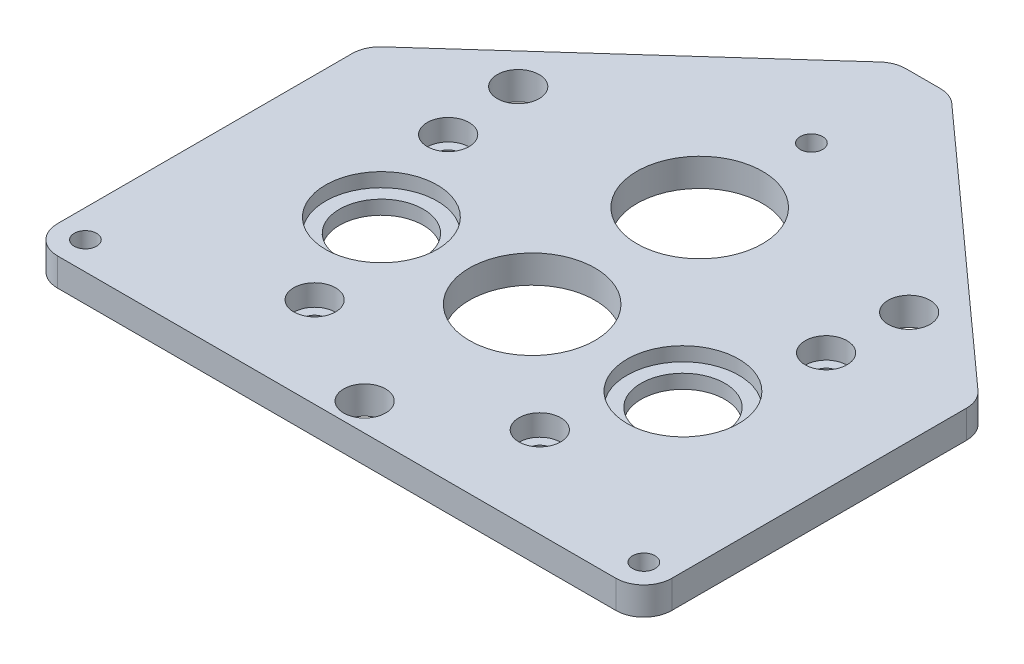
ISO-10303-21;
HEADER;
FILE_DESCRIPTION(('STEP AP214'),'2;1');
FILE_NAME('part.step','',(''),(''),'','','');
FILE_SCHEMA(('AUTOMOTIVE_DESIGN { 1 0 10303 214 1 1 1 1 }'));
ENDSEC;
DATA;
#1=APPLICATION_CONTEXT('core data for automotive mechanical design processes');
#2=APPLICATION_PROTOCOL_DEFINITION('international standard','automotive_design',2000,#1);
#3=PRODUCT_CONTEXT('',#1,'mechanical');
#4=PRODUCT('Part','Part','',(#3));
#5=PRODUCT_RELATED_PRODUCT_CATEGORY('part','',(#4));
#6=PRODUCT_DEFINITION_FORMATION('','',#4);
#7=PRODUCT_DEFINITION_CONTEXT('part definition',#1,'design');
#8=PRODUCT_DEFINITION('design','',#6,#7);
#9=PRODUCT_DEFINITION_SHAPE('','',#8);
#10=(LENGTH_UNIT() NAMED_UNIT(*) SI_UNIT(.MILLI.,.METRE.));
#11=(NAMED_UNIT(*) PLANE_ANGLE_UNIT() SI_UNIT($,.RADIAN.));
#12=(NAMED_UNIT(*) SI_UNIT($,.STERADIAN.) SOLID_ANGLE_UNIT());
#13=UNCERTAINTY_MEASURE_WITH_UNIT(LENGTH_MEASURE(1.E-05),#10,'distance_accuracy_value','');
#14=(GEOMETRIC_REPRESENTATION_CONTEXT(3) GLOBAL_UNCERTAINTY_ASSIGNED_CONTEXT((#13)) GLOBAL_UNIT_ASSIGNED_CONTEXT((#10,
#11,#12)) REPRESENTATION_CONTEXT('',''));
#15=CARTESIAN_POINT('',(0.,0.,0.));
#16=DIRECTION('',(0.,0.,1.));
#17=DIRECTION('',(1.,0.,0.));
#18=AXIS2_PLACEMENT_3D('',#15,#16,#17);
#19=CARTESIAN_POINT('',(34.29,0.,-25.4));
#20=DIRECTION('',(0.,1.,0.));
#21=DIRECTION('',(0.,0.,1.));
#22=AXIS2_PLACEMENT_3D('',#19,#20,#21);
#23=CYLINDRICAL_SURFACE('',#22,9.525);
#24=CARTESIAN_POINT('',(34.29,0.,-25.4));
#25=DIRECTION('',(0.,1.,0.));
#26=DIRECTION('',(0.,0.,1.));
#27=AXIS2_PLACEMENT_3D('',#24,#25,#26);
#28=CIRCLE('',#27,9.525);
#29=CARTESIAN_POINT('',(34.29,0.,-15.875));
#30=VERTEX_POINT('',#29);
#31=EDGE_CURVE('E261',#30,#30,#28,.T.);
#32=ORIENTED_EDGE('',*,*,#31,.F.);
#33=EDGE_LOOP('',(#32));
#34=FACE_BOUND('',#33,.T.);
#35=CARTESIAN_POINT('',(34.29,3.175,-25.4));
#36=DIRECTION('',(0.,1.,0.));
#37=DIRECTION('',(0.,0.,1.));
#38=AXIS2_PLACEMENT_3D('',#35,#36,#37);
#39=CIRCLE('',#38,9.525);
#40=CARTESIAN_POINT('',(34.29,3.175,-15.875));
#41=VERTEX_POINT('',#40);
#42=EDGE_CURVE('E166',#41,#41,#39,.F.);
#43=ORIENTED_EDGE('',*,*,#42,.F.);
#44=EDGE_LOOP('',(#43));
#45=FACE_BOUND('',#44,.T.);
#46=ADVANCED_FACE('F33',(#34,#45),#23,.F.);
#47=CARTESIAN_POINT('',(-34.29,0.,-25.4));
#48=DIRECTION('',(0.,1.,0.));
#49=DIRECTION('',(0.,0.,1.));
#50=AXIS2_PLACEMENT_3D('',#47,#48,#49);
#51=CYLINDRICAL_SURFACE('',#50,9.525);
#52=CARTESIAN_POINT('',(-34.29,0.,-25.4));
#53=DIRECTION('',(0.,1.,0.));
#54=DIRECTION('',(0.,0.,1.));
#55=AXIS2_PLACEMENT_3D('',#52,#53,#54);
#56=CIRCLE('',#55,9.525);
#57=CARTESIAN_POINT('',(-34.29,0.,-15.875));
#58=VERTEX_POINT('',#57);
#59=EDGE_CURVE('E234',#58,#58,#56,.T.);
#60=ORIENTED_EDGE('',*,*,#59,.F.);
#61=EDGE_LOOP('',(#60));
#62=FACE_BOUND('',#61,.T.);
#63=CARTESIAN_POINT('',(-34.29,3.175,-25.4));
#64=DIRECTION('',(0.,1.,0.));
#65=DIRECTION('',(0.,0.,1.));
#66=AXIS2_PLACEMENT_3D('',#63,#64,#65);
#67=CIRCLE('',#66,9.525);
#68=CARTESIAN_POINT('',(-34.29,3.175,-15.875));
#69=VERTEX_POINT('',#68);
#70=EDGE_CURVE('E161',#69,#69,#67,.F.);
#71=ORIENTED_EDGE('',*,*,#70,.F.);
#72=EDGE_LOOP('',(#71));
#73=FACE_BOUND('',#72,.T.);
#74=ADVANCED_FACE('F396',(#62,#73),#51,.F.);
#75=CARTESIAN_POINT('',(69.85,6.35,-57.15));
#76=DIRECTION('',(-0.66896473162245,0.,0.743294146247166));
#77=DIRECTION('',(0.743294146247166,0.,0.66896473162245));
#78=AXIS2_PLACEMENT_3D('',#75,#76,#77);
#79=PLANE('',#78);
#80=DIRECTION('',(-0.743294146247166,0.,-0.66896473162245));
#81=VECTOR('',#80,1.);
#82=CARTESIAN_POINT('',(69.85,0.,-57.15));
#83=LINE('',#82,#81);
#84=CARTESIAN_POINT('',(67.7479260458025,0.,-59.0418665587777));
#85=VERTEX_POINT('',#84);
#86=CARTESIAN_POINT('',(8.16120241258942,0.,-112.669917828669));
#87=VERTEX_POINT('',#86);
#88=EDGE_CURVE('E232',#85,#87,#83,.T.);
#89=ORIENTED_EDGE('',*,*,#88,.T.);
#90=DIRECTION('',(0.,-1.,0.));
#91=VECTOR('',#90,1.);
#92=CARTESIAN_POINT('',(8.16120241258941,6.35,-112.669917828669));
#93=LINE('',#92,#91);
#94=CARTESIAN_POINT('',(8.16120241258942,6.35,-112.669917828669));
#95=VERTEX_POINT('',#94);
#96=EDGE_CURVE('E208',#87,#95,#93,.F.);
#97=ORIENTED_EDGE('',*,*,#96,.T.);
#98=DIRECTION('',(-0.743294146247166,0.,-0.66896473162245));
#99=VECTOR('',#98,1.);
#100=CARTESIAN_POINT('',(69.85,6.35,-57.15));
#101=LINE('',#100,#99);
#102=CARTESIAN_POINT('',(67.7479260458025,6.35,-59.0418665587777));
#103=VERTEX_POINT('',#102);
#104=EDGE_CURVE('E160',#103,#95,#101,.T.);
#105=ORIENTED_EDGE('',*,*,#104,.F.);
#106=DIRECTION('',(0.,-1.,0.));
#107=VECTOR('',#106,1.);
#108=CARTESIAN_POINT('',(67.7479260458025,6.35,-59.0418665587777));
#109=LINE('',#108,#107);
#110=EDGE_CURVE('E205',#103,#85,#109,.T.);
#111=ORIENTED_EDGE('',*,*,#110,.T.);
#112=EDGE_LOOP('',(#89,#97,#105,#111));
#113=FACE_BOUND('',#112,.T.);
#114=ADVANCED_FACE('F399',(#113),#79,.F.);
#115=CARTESIAN_POINT('',(6.34999999999999,6.35,-114.3));
#116=DIRECTION('',(0.,0.,1.));
#117=DIRECTION('',(1.,0.,0.));
#118=AXIS2_PLACEMENT_3D('',#115,#116,#117);
#119=PLANE('',#118);
#120=DIRECTION('',(-1.,0.,0.));
#121=VECTOR('',#120,1.);
#122=CARTESIAN_POINT('',(6.34999999999999,0.,-114.3));
#123=LINE('',#122,#121);
#124=CARTESIAN_POINT('',(3.91327636678685,0.,-114.3));
#125=VERTEX_POINT('',#124);
#126=CARTESIAN_POINT('',(-3.91327636678688,0.,-114.3));
#127=VERTEX_POINT('',#126);
#128=EDGE_CURVE('E155',#125,#127,#123,.T.);
#129=ORIENTED_EDGE('',*,*,#128,.T.);
#130=DIRECTION('',(0.,-1.,0.));
#131=VECTOR('',#130,1.);
#132=CARTESIAN_POINT('',(-3.91327636678688,6.35,-114.3));
#133=LINE('',#132,#131);
#134=CARTESIAN_POINT('',(-3.91327636678688,6.35,-114.3));
#135=VERTEX_POINT('',#134);
#136=EDGE_CURVE('E203',#127,#135,#133,.F.);
#137=ORIENTED_EDGE('',*,*,#136,.T.);
#138=DIRECTION('',(-1.,0.,0.));
#139=VECTOR('',#138,1.);
#140=CARTESIAN_POINT('',(6.34999999999999,6.35,-114.3));
#141=LINE('',#140,#139);
#142=CARTESIAN_POINT('',(3.91327636678685,6.35,-114.3));
#143=VERTEX_POINT('',#142);
#144=EDGE_CURVE('E251',#143,#135,#141,.T.);
#145=ORIENTED_EDGE('',*,*,#144,.F.);
#146=DIRECTION('',(0.,-1.,0.));
#147=VECTOR('',#146,1.);
#148=CARTESIAN_POINT('',(3.91327636678685,6.35,-114.3));
#149=LINE('',#148,#147);
#150=EDGE_CURVE('E200',#143,#125,#149,.T.);
#151=ORIENTED_EDGE('',*,*,#150,.T.);
#152=EDGE_LOOP('',(#129,#137,#145,#151));
#153=FACE_BOUND('',#152,.T.);
#154=ADVANCED_FACE('F239',(#153),#119,.F.);
#155=CARTESIAN_POINT('',(-6.35000000000001,6.35,-114.3));
#156=DIRECTION('',(0.66896473162245,0.,0.743294146247166));
#157=DIRECTION('',(0.743294146247166,0.,-0.66896473162245));
#158=AXIS2_PLACEMENT_3D('',#155,#156,#157);
#159=PLANE('',#158);
#160=DIRECTION('',(-0.743294146247166,0.,0.66896473162245));
#161=VECTOR('',#160,1.);
#162=CARTESIAN_POINT('',(-6.35000000000001,0.,-114.3));
#163=LINE('',#162,#161);
#164=CARTESIAN_POINT('',(-8.16120241258944,0.,-112.66991782867));
#165=VERTEX_POINT('',#164);
#166=CARTESIAN_POINT('',(-67.7479260458025,0.,-59.0418665587777));
#167=VERTEX_POINT('',#166);
#168=EDGE_CURVE('E150',#165,#167,#163,.T.);
#169=ORIENTED_EDGE('',*,*,#168,.T.);
#170=DIRECTION('',(0.,-1.,0.));
#171=VECTOR('',#170,1.);
#172=CARTESIAN_POINT('',(-67.7479260458026,6.35,-59.0418665587777));
#173=LINE('',#172,#171);
#174=CARTESIAN_POINT('',(-67.7479260458025,6.35,-59.0418665587777));
#175=VERTEX_POINT('',#174);
#176=EDGE_CURVE('E128',#167,#175,#173,.F.);
#177=ORIENTED_EDGE('',*,*,#176,.T.);
#178=DIRECTION('',(-0.743294146247166,0.,0.66896473162245));
#179=VECTOR('',#178,1.);
#180=CARTESIAN_POINT('',(-6.35000000000001,6.35,-114.3));
#181=LINE('',#180,#179);
#182=CARTESIAN_POINT('',(-8.16120241258944,6.35,-112.66991782867));
#183=VERTEX_POINT('',#182);
#184=EDGE_CURVE('E250',#183,#175,#181,.T.);
#185=ORIENTED_EDGE('',*,*,#184,.F.);
#186=DIRECTION('',(0.,-1.,0.));
#187=VECTOR('',#186,1.);
#188=CARTESIAN_POINT('',(-8.16120241258944,6.35,-112.66991782867));
#189=LINE('',#188,#187);
#190=EDGE_CURVE('E133',#183,#165,#189,.T.);
#191=ORIENTED_EDGE('',*,*,#190,.T.);
#192=EDGE_LOOP('',(#169,#177,#185,#191));
#193=FACE_BOUND('',#192,.T.);
#194=ADVANCED_FACE('F253',(#193),#159,.F.);
#195=CARTESIAN_POINT('',(-69.85,6.35,-57.15));
#196=DIRECTION('',(1.,0.,0.));
#197=DIRECTION('',(0.,0.,-1.));
#198=AXIS2_PLACEMENT_3D('',#195,#196,#197);
#199=PLANE('',#198);
#200=DIRECTION('',(0.,0.,1.));
#201=VECTOR('',#200,1.);
#202=CARTESIAN_POINT('',(-69.85,6.35,-57.15));
#203=LINE('',#202,#201);
#204=CARTESIAN_POINT('',(-69.85,6.35,-54.3219487301082));
#205=VERTEX_POINT('',#204);
#206=CARTESIAN_POINT('',(-69.85,6.35,12.7));
#207=VERTEX_POINT('',#206);
#208=EDGE_CURVE('E143',#205,#207,#203,.T.);
#209=ORIENTED_EDGE('',*,*,#208,.F.);
#210=DIRECTION('',(0.,-1.,0.));
#211=VECTOR('',#210,1.);
#212=CARTESIAN_POINT('',(-69.85,6.35,-54.3219487301082));
#213=LINE('',#212,#211);
#214=CARTESIAN_POINT('',(-69.85,0.,-54.3219487301082));
#215=VERTEX_POINT('',#214);
#216=EDGE_CURVE('E127',#205,#215,#213,.T.);
#217=ORIENTED_EDGE('',*,*,#216,.T.);
#218=DIRECTION('',(0.,0.,1.));
#219=VECTOR('',#218,1.);
#220=CARTESIAN_POINT('',(-69.85,0.,-57.15));
#221=LINE('',#220,#219);
#222=CARTESIAN_POINT('',(-69.85,0.,12.7));
#223=VERTEX_POINT('',#222);
#224=EDGE_CURVE('E140',#215,#223,#221,.T.);
#225=ORIENTED_EDGE('',*,*,#224,.T.);
#226=DIRECTION('',(0.,-1.,0.));
#227=VECTOR('',#226,1.);
#228=CARTESIAN_POINT('',(-69.85,6.35,12.7));
#229=LINE('',#228,#227);
#230=EDGE_CURVE('E145',#223,#207,#229,.F.);
#231=ORIENTED_EDGE('',*,*,#230,.T.);
#232=EDGE_LOOP('',(#209,#217,#225,#231));
#233=FACE_BOUND('',#232,.T.);
#234=ADVANCED_FACE('F139',(#233),#199,.F.);
#235=CARTESIAN_POINT('',(-69.85,6.35,19.05));
#236=DIRECTION('',(0.,0.,-1.));
#237=DIRECTION('',(-1.,0.,0.));
#238=AXIS2_PLACEMENT_3D('',#235,#236,#237);
#239=PLANE('',#238);
#240=DIRECTION('',(1.,0.,0.));
#241=VECTOR('',#240,1.);
#242=CARTESIAN_POINT('',(-69.85,0.,19.05));
#243=LINE('',#242,#241);
#244=CARTESIAN_POINT('',(-63.5,0.,19.05));
#245=VERTEX_POINT('',#244);
#246=CARTESIAN_POINT('',(63.5,0.,19.05));
#247=VERTEX_POINT('',#246);
#248=EDGE_CURVE('E149',#245,#247,#243,.T.);
#249=ORIENTED_EDGE('',*,*,#248,.T.);
#250=DIRECTION('',(0.,-1.,0.));
#251=VECTOR('',#250,1.);
#252=CARTESIAN_POINT('',(63.5,6.35,19.05));
#253=LINE('',#252,#251);
#254=CARTESIAN_POINT('',(63.5,6.35,19.05));
#255=VERTEX_POINT('',#254);
#256=EDGE_CURVE('E11',#247,#255,#253,.F.);
#257=ORIENTED_EDGE('',*,*,#256,.T.);
#258=DIRECTION('',(1.,0.,0.));
#259=VECTOR('',#258,1.);
#260=CARTESIAN_POINT('',(-69.85,6.35,19.05));
#261=LINE('',#260,#259);
#262=CARTESIAN_POINT('',(-63.5,6.35,19.05));
#263=VERTEX_POINT('',#262);
#264=EDGE_CURVE('E219',#263,#255,#261,.T.);
#265=ORIENTED_EDGE('',*,*,#264,.F.);
#266=DIRECTION('',(0.,-1.,0.));
#267=VECTOR('',#266,1.);
#268=CARTESIAN_POINT('',(-63.5,6.35,19.05));
#269=LINE('',#268,#267);
#270=EDGE_CURVE('E41',#263,#245,#269,.T.);
#271=ORIENTED_EDGE('',*,*,#270,.T.);
#272=EDGE_LOOP('',(#249,#257,#265,#271));
#273=FACE_BOUND('',#272,.T.);
#274=ADVANCED_FACE('F217',(#273),#239,.F.);
#275=CARTESIAN_POINT('',(69.85,6.35,19.05));
#276=DIRECTION('',(-1.,0.,0.));
#277=DIRECTION('',(0.,0.,1.));
#278=AXIS2_PLACEMENT_3D('',#275,#276,#277);
#279=PLANE('',#278);
#280=DIRECTION('',(0.,0.,-1.));
#281=VECTOR('',#280,1.);
#282=CARTESIAN_POINT('',(69.85,0.,19.05));
#283=LINE('',#282,#281);
#284=CARTESIAN_POINT('',(69.85,0.,12.7));
#285=VERTEX_POINT('',#284);
#286=CARTESIAN_POINT('',(69.85,0.,-54.3219487301082));
#287=VERTEX_POINT('',#286);
#288=EDGE_CURVE('E153',#285,#287,#283,.T.);
#289=ORIENTED_EDGE('',*,*,#288,.T.);
#290=DIRECTION('',(0.,-1.,0.));
#291=VECTOR('',#290,1.);
#292=CARTESIAN_POINT('',(69.85,6.35,-54.3219487301082));
#293=LINE('',#292,#291);
#294=CARTESIAN_POINT('',(69.85,6.35,-54.3219487301082));
#295=VERTEX_POINT('',#294);
#296=EDGE_CURVE('E48',#287,#295,#293,.F.);
#297=ORIENTED_EDGE('',*,*,#296,.T.);
#298=DIRECTION('',(0.,0.,-1.));
#299=VECTOR('',#298,1.);
#300=CARTESIAN_POINT('',(69.85,6.35,19.05));
#301=LINE('',#300,#299);
#302=CARTESIAN_POINT('',(69.85,6.35,12.7));
#303=VERTEX_POINT('',#302);
#304=EDGE_CURVE('E176',#303,#295,#301,.T.);
#305=ORIENTED_EDGE('',*,*,#304,.F.);
#306=DIRECTION('',(0.,-1.,0.));
#307=VECTOR('',#306,1.);
#308=CARTESIAN_POINT('',(69.85,6.35,12.7));
#309=LINE('',#308,#307);
#310=EDGE_CURVE('E210',#303,#285,#309,.T.);
#311=ORIENTED_EDGE('',*,*,#310,.T.);
#312=EDGE_LOOP('',(#289,#297,#305,#311));
#313=FACE_BOUND('',#312,.T.);
#314=ADVANCED_FACE('F226',(#313),#279,.F.);
#315=CARTESIAN_POINT('',(0.,6.35,0.));
#316=DIRECTION('',(0.,1.,0.));
#317=DIRECTION('',(0.,0.,1.));
#318=AXIS2_PLACEMENT_3D('',#315,#316,#317);
#319=PLANE('',#318);
#320=CARTESIAN_POINT('',(-44.4500000000001,6.35,-66.675));
#321=DIRECTION('',(0.,1.,0.));
#322=DIRECTION('',(0.,0.,1.));
#323=AXIS2_PLACEMENT_3D('',#320,#321,#322);
#324=CIRCLE('',#323,4.76249999999999);
#325=CARTESIAN_POINT('',(-44.4500000000001,6.35,-61.9125));
#326=VERTEX_POINT('',#325);
#327=EDGE_CURVE('E351',#326,#326,#324,.T.);
#328=ORIENTED_EDGE('',*,*,#327,.F.);
#329=EDGE_LOOP('',(#328));
#330=FACE_BOUND('',#329,.T.);
#331=CARTESIAN_POINT('',(-1.02863554148431E-13,6.35,12.7));
#332=DIRECTION('',(0.,1.,0.));
#333=DIRECTION('',(0.,0.,1.));
#334=AXIS2_PLACEMENT_3D('',#331,#332,#333);
#335=CIRCLE('',#334,4.7625);
#336=CARTESIAN_POINT('',(-1.02863554148431E-13,6.35,17.4625));
#337=VERTEX_POINT('',#336);
#338=EDGE_CURVE('E354',#337,#337,#335,.T.);
#339=ORIENTED_EDGE('',*,*,#338,.F.);
#340=EDGE_LOOP('',(#339));
#341=FACE_BOUND('',#340,.T.);
#342=CARTESIAN_POINT('',(44.4499999999999,6.35,-66.675));
#343=DIRECTION('',(0.,1.,0.));
#344=DIRECTION('',(0.,0.,1.));
#345=AXIS2_PLACEMENT_3D('',#342,#343,#344);
#346=CIRCLE('',#345,4.7625);
#347=CARTESIAN_POINT('',(44.4499999999999,6.35,-61.9125));
#348=VERTEX_POINT('',#347);
#349=EDGE_CURVE('E345',#348,#348,#346,.T.);
#350=ORIENTED_EDGE('',*,*,#349,.F.);
#351=EDGE_LOOP('',(#350));
#352=FACE_BOUND('',#351,.T.);
#353=CARTESIAN_POINT('',(-63.5000000000001,6.35,12.7));
#354=DIRECTION('',(0.,1.,0.));
#355=DIRECTION('',(0.,0.,1.));
#356=AXIS2_PLACEMENT_3D('',#353,#354,#355);
#357=CIRCLE('',#356,2.55269999999999);
#358=CARTESIAN_POINT('',(-63.5000000000001,6.35,15.2527));
#359=VERTEX_POINT('',#358);
#360=EDGE_CURVE('E171',#359,#359,#357,.T.);
#361=ORIENTED_EDGE('',*,*,#360,.F.);
#362=EDGE_LOOP('',(#361));
#363=FACE_BOUND('',#362,.T.);
#364=CARTESIAN_POINT('',(63.5000000000001,6.35,12.7));
#365=DIRECTION('',(0.,1.,0.));
#366=DIRECTION('',(0.,0.,1.));
#367=AXIS2_PLACEMENT_3D('',#364,#365,#366);
#368=CIRCLE('',#367,2.55269999999999);
#369=CARTESIAN_POINT('',(63.5000000000001,6.35,15.2527));
#370=VERTEX_POINT('',#369);
#371=EDGE_CURVE('E338',#370,#370,#368,.T.);
#372=ORIENTED_EDGE('',*,*,#371,.F.);
#373=EDGE_LOOP('',(#372));
#374=FACE_BOUND('',#373,.T.);
#375=CARTESIAN_POINT('',(0.,6.35,-88.9));
#376=DIRECTION('',(0.,1.,0.));
#377=DIRECTION('',(0.,0.,1.));
#378=AXIS2_PLACEMENT_3D('',#375,#376,#377);
#379=CIRCLE('',#378,2.55269999999999);
#380=CARTESIAN_POINT('',(0.,6.35,-86.3473));
#381=VERTEX_POINT('',#380);
#382=EDGE_CURVE('E332',#381,#381,#379,.T.);
#383=ORIENTED_EDGE('',*,*,#382,.F.);
#384=EDGE_LOOP('',(#383));
#385=FACE_BOUND('',#384,.T.);
#386=CARTESIAN_POINT('',(25.6026883595282,6.35,-1.53180743203787));
#387=DIRECTION('',(0.,1.,0.));
#388=DIRECTION('',(0.,0.,1.));
#389=AXIS2_PLACEMENT_3D('',#386,#387,#388);
#390=CIRCLE('',#389,4.76249999999999);
#391=CARTESIAN_POINT('',(25.6026883595282,6.35,3.23069256796212));
#392=VERTEX_POINT('',#391);
#393=EDGE_CURVE('E329',#392,#392,#390,.T.);
#394=ORIENTED_EDGE('',*,*,#393,.F.);
#395=EDGE_LOOP('',(#394));
#396=FACE_BOUND('',#395,.T.);
#397=CARTESIAN_POINT('',(42.9773116404718,6.35,-49.2681925679621));
#398=DIRECTION('',(0.,1.,0.));
#399=DIRECTION('',(0.,0.,1.));
#400=AXIS2_PLACEMENT_3D('',#397,#398,#399);
#401=CIRCLE('',#400,4.7625);
#402=CARTESIAN_POINT('',(42.9773116404718,6.35,-44.5056925679621));
#403=VERTEX_POINT('',#402);
#404=EDGE_CURVE('E317',#403,#403,#401,.T.);
#405=ORIENTED_EDGE('',*,*,#404,.F.);
#406=EDGE_LOOP('',(#405));
#407=FACE_BOUND('',#406,.T.);
#408=CARTESIAN_POINT('',(-25.6026883595282,6.35,-1.53180743203787));
#409=DIRECTION('',(0.,1.,0.));
#410=DIRECTION('',(0.,0.,1.));
#411=AXIS2_PLACEMENT_3D('',#408,#409,#410);
#412=CIRCLE('',#411,4.76249999999999);
#413=CARTESIAN_POINT('',(-25.6026883595282,6.35,3.23069256796212));
#414=VERTEX_POINT('',#413);
#415=EDGE_CURVE('E305',#414,#414,#412,.T.);
#416=ORIENTED_EDGE('',*,*,#415,.F.);
#417=EDGE_LOOP('',(#416));
#418=FACE_BOUND('',#417,.T.);
#419=CARTESIAN_POINT('',(-42.9773116404718,6.35,-49.2681925679621));
#420=DIRECTION('',(0.,1.,0.));
#421=DIRECTION('',(0.,0.,1.));
#422=AXIS2_PLACEMENT_3D('',#419,#420,#421);
#423=CIRCLE('',#422,4.7625);
#424=CARTESIAN_POINT('',(-42.9773116404718,6.35,-44.5056925679621));
#425=VERTEX_POINT('',#424);
#426=EDGE_CURVE('E293',#425,#425,#423,.T.);
#427=ORIENTED_EDGE('',*,*,#426,.F.);
#428=EDGE_LOOP('',(#427));
#429=FACE_BOUND('',#428,.T.);
#430=CARTESIAN_POINT('',(0.,6.35,-63.5));
#431=DIRECTION('',(0.,1.,0.));
#432=DIRECTION('',(0.,0.,1.));
#433=AXIS2_PLACEMENT_3D('',#430,#431,#432);
#434=CIRCLE('',#433,14.2875);
#435=CARTESIAN_POINT('',(0.,6.35,-49.2125));
#436=VERTEX_POINT('',#435);
#437=EDGE_CURVE('E279',#436,#436,#434,.T.);
#438=ORIENTED_EDGE('',*,*,#437,.F.);
#439=EDGE_LOOP('',(#438));
#440=FACE_BOUND('',#439,.T.);
#441=CARTESIAN_POINT('',(34.29,6.35,-25.4));
#442=DIRECTION('',(0.,1.,0.));
#443=DIRECTION('',(0.,0.,1.));
#444=AXIS2_PLACEMENT_3D('',#441,#442,#443);
#445=CIRCLE('',#444,12.7);
#446=CARTESIAN_POINT('',(34.29,6.35,-12.7));
#447=VERTEX_POINT('',#446);
#448=EDGE_CURVE('E273',#447,#447,#445,.T.);
#449=ORIENTED_EDGE('',*,*,#448,.F.);
#450=EDGE_LOOP('',(#449));
#451=FACE_BOUND('',#450,.T.);
#452=CARTESIAN_POINT('',(-34.29,6.35,-25.4));
#453=DIRECTION('',(0.,1.,0.));
#454=DIRECTION('',(0.,0.,1.));
#455=AXIS2_PLACEMENT_3D('',#452,#453,#454);
#456=CIRCLE('',#455,12.7);
#457=CARTESIAN_POINT('',(-34.29,6.35,-12.7));
#458=VERTEX_POINT('',#457);
#459=EDGE_CURVE('E169',#458,#458,#456,.T.);
#460=ORIENTED_EDGE('',*,*,#459,.F.);
#461=EDGE_LOOP('',(#460));
#462=FACE_BOUND('',#461,.T.);
#463=CARTESIAN_POINT('',(0.,6.35,-25.4));
#464=DIRECTION('',(0.,1.,0.));
#465=DIRECTION('',(0.,0.,1.));
#466=AXIS2_PLACEMENT_3D('',#463,#464,#465);
#467=CIRCLE('',#466,14.2875);
#468=CARTESIAN_POINT('',(0.,6.35,-11.1125));
#469=VERTEX_POINT('',#468);
#470=EDGE_CURVE('E164',#469,#469,#467,.T.);
#471=ORIENTED_EDGE('',*,*,#470,.F.);
#472=EDGE_LOOP('',(#471));
#473=FACE_BOUND('',#472,.T.);
#474=ORIENTED_EDGE('',*,*,#184,.T.);
#475=CARTESIAN_POINT('',(-63.5,6.35,-54.3219487301082));
#476=DIRECTION('',(0.,1.,0.));
#477=DIRECTION('',(0.,0.,1.));
#478=AXIS2_PLACEMENT_3D('',#475,#476,#477);
#479=CIRCLE('',#478,6.35);
#480=EDGE_CURVE('E198',#175,#205,#479,.T.);
#481=ORIENTED_EDGE('',*,*,#480,.T.);
#482=ORIENTED_EDGE('',*,*,#208,.T.);
#483=CARTESIAN_POINT('',(-63.5,6.35,12.7));
#484=DIRECTION('',(0.,1.,0.));
#485=DIRECTION('',(0.,0.,1.));
#486=AXIS2_PLACEMENT_3D('',#483,#484,#485);
#487=CIRCLE('',#486,6.35);
#488=EDGE_CURVE('E189',#207,#263,#487,.T.);
#489=ORIENTED_EDGE('',*,*,#488,.T.);
#490=ORIENTED_EDGE('',*,*,#264,.T.);
#491=CARTESIAN_POINT('',(63.5,6.35,12.7));
#492=DIRECTION('',(0.,1.,0.));
#493=DIRECTION('',(0.,0.,1.));
#494=AXIS2_PLACEMENT_3D('',#491,#492,#493);
#495=CIRCLE('',#494,6.35);
#496=EDGE_CURVE('E55',#255,#303,#495,.T.);
#497=ORIENTED_EDGE('',*,*,#496,.T.);
#498=ORIENTED_EDGE('',*,*,#304,.T.);
#499=CARTESIAN_POINT('',(63.5,6.35,-54.3219487301082));
#500=DIRECTION('',(0.,1.,0.));
#501=DIRECTION('',(0.,0.,1.));
#502=AXIS2_PLACEMENT_3D('',#499,#500,#501);
#503=CIRCLE('',#502,6.35);
#504=EDGE_CURVE('E192',#295,#103,#503,.T.);
#505=ORIENTED_EDGE('',*,*,#504,.T.);
#506=ORIENTED_EDGE('',*,*,#104,.T.);
#507=CARTESIAN_POINT('',(3.91327636678685,6.35,-107.95));
#508=DIRECTION('',(0.,1.,0.));
#509=DIRECTION('',(0.,0.,1.));
#510=AXIS2_PLACEMENT_3D('',#507,#508,#509);
#511=CIRCLE('',#510,6.35);
#512=EDGE_CURVE('E194',#95,#143,#511,.T.);
#513=ORIENTED_EDGE('',*,*,#512,.T.);
#514=ORIENTED_EDGE('',*,*,#144,.T.);
#515=CARTESIAN_POINT('',(-3.91327636678688,6.35,-107.95));
#516=DIRECTION('',(0.,1.,0.));
#517=DIRECTION('',(0.,0.,1.));
#518=AXIS2_PLACEMENT_3D('',#515,#516,#517);
#519=CIRCLE('',#518,6.35);
#520=EDGE_CURVE('E196',#135,#183,#519,.T.);
#521=ORIENTED_EDGE('',*,*,#520,.T.);
#522=EDGE_LOOP('',(#474,#481,#482,#489,#490,#497,#498,#505,#506,#513,#514,#521));
#523=FACE_BOUND('',#522,.T.);
#524=ADVANCED_FACE('F249',(#330,#341,#352,#363,#374,#385,#396,#407,#418,#429,#440,#451,#462,
#473,#523),#319,.T.);
#525=CARTESIAN_POINT('',(0.,0.,0.));
#526=DIRECTION('',(0.,1.,0.));
#527=DIRECTION('',(0.,0.,1.));
#528=AXIS2_PLACEMENT_3D('',#525,#526,#527);
#529=PLANE('',#528);
#530=CARTESIAN_POINT('',(-44.4500000000001,0.,-66.675));
#531=DIRECTION('',(0.,-1.,0.));
#532=DIRECTION('',(0.,0.,-1.));
#533=AXIS2_PLACEMENT_3D('',#530,#531,#532);
#534=CIRCLE('',#533,4.76249999999999);
#535=CARTESIAN_POINT('',(-44.4500000000001,0.,-71.4375));
#536=VERTEX_POINT('',#535);
#537=EDGE_CURVE('E357',#536,#536,#534,.T.);
#538=ORIENTED_EDGE('',*,*,#537,.F.);
#539=EDGE_LOOP('',(#538));
#540=FACE_BOUND('',#539,.T.);
#541=CARTESIAN_POINT('',(-1.02863554148431E-13,0.,12.7));
#542=DIRECTION('',(0.,-1.,0.));
#543=DIRECTION('',(0.,0.,-1.));
#544=AXIS2_PLACEMENT_3D('',#541,#542,#543);
#545=CIRCLE('',#544,4.7625);
#546=CARTESIAN_POINT('',(-1.02863554148431E-13,0.,7.93750000000001));
#547=VERTEX_POINT('',#546);
#548=EDGE_CURVE('E358',#547,#547,#545,.T.);
#549=ORIENTED_EDGE('',*,*,#548,.F.);
#550=EDGE_LOOP('',(#549));
#551=FACE_BOUND('',#550,.T.);
#552=CARTESIAN_POINT('',(44.4499999999999,0.,-66.675));
#553=DIRECTION('',(0.,-1.,0.));
#554=DIRECTION('',(0.,0.,-1.));
#555=AXIS2_PLACEMENT_3D('',#552,#553,#554);
#556=CIRCLE('',#555,4.7625);
#557=CARTESIAN_POINT('',(44.4499999999999,0.,-71.4375));
#558=VERTEX_POINT('',#557);
#559=EDGE_CURVE('E348',#558,#558,#556,.T.);
#560=ORIENTED_EDGE('',*,*,#559,.F.);
#561=EDGE_LOOP('',(#560));
#562=FACE_BOUND('',#561,.T.);
#563=CARTESIAN_POINT('',(-63.5000000000001,0.,12.7));
#564=DIRECTION('',(0.,1.,0.));
#565=DIRECTION('',(0.,0.,1.));
#566=AXIS2_PLACEMENT_3D('',#563,#564,#565);
#567=CIRCLE('',#566,2.55269999999998);
#568=CARTESIAN_POINT('',(-63.5000000000001,0.,15.2527));
#569=VERTEX_POINT('',#568);
#570=EDGE_CURVE('E175',#569,#569,#567,.T.);
#571=ORIENTED_EDGE('',*,*,#570,.T.);
#572=EDGE_LOOP('',(#571));
#573=FACE_BOUND('',#572,.T.);
#574=CARTESIAN_POINT('',(63.5000000000001,0.,12.7));
#575=DIRECTION('',(0.,1.,0.));
#576=DIRECTION('',(0.,0.,1.));
#577=AXIS2_PLACEMENT_3D('',#574,#575,#576);
#578=CIRCLE('',#577,2.55269999999998);
#579=CARTESIAN_POINT('',(63.5000000000001,0.,15.2527));
#580=VERTEX_POINT('',#579);
#581=EDGE_CURVE('E174',#580,#580,#578,.T.);
#582=ORIENTED_EDGE('',*,*,#581,.T.);
#583=EDGE_LOOP('',(#582));
#584=FACE_BOUND('',#583,.T.);
#585=CARTESIAN_POINT('',(0.,0.,-88.9));
#586=DIRECTION('',(0.,1.,0.));
#587=DIRECTION('',(0.,0.,1.));
#588=AXIS2_PLACEMENT_3D('',#585,#586,#587);
#589=CIRCLE('',#588,2.55269999999998);
#590=CARTESIAN_POINT('',(0.,0.,-86.3473));
#591=VERTEX_POINT('',#590);
#592=EDGE_CURVE('E335',#591,#591,#589,.T.);
#593=ORIENTED_EDGE('',*,*,#592,.T.);
#594=EDGE_LOOP('',(#593));
#595=FACE_BOUND('',#594,.T.);
#596=CARTESIAN_POINT('',(25.6026883595282,0.,-1.53180743203787));
#597=DIRECTION('',(0.,1.,0.));
#598=DIRECTION('',(0.,0.,1.));
#599=AXIS2_PLACEMENT_3D('',#596,#597,#598);
#600=CIRCLE('',#599,2.5527);
#601=CARTESIAN_POINT('',(25.6026883595282,0.,1.02089256796213));
#602=VERTEX_POINT('',#601);
#603=EDGE_CURVE('E320',#602,#602,#600,.T.);
#604=ORIENTED_EDGE('',*,*,#603,.T.);
#605=EDGE_LOOP('',(#604));
#606=FACE_BOUND('',#605,.T.);
#607=CARTESIAN_POINT('',(42.9773116404718,0.,-49.2681925679621));
#608=DIRECTION('',(0.,1.,0.));
#609=DIRECTION('',(0.,0.,1.));
#610=AXIS2_PLACEMENT_3D('',#607,#608,#609);
#611=CIRCLE('',#610,2.5527);
#612=CARTESIAN_POINT('',(42.9773116404718,0.,-46.7154925679621));
#613=VERTEX_POINT('',#612);
#614=EDGE_CURVE('E308',#613,#613,#611,.T.);
#615=ORIENTED_EDGE('',*,*,#614,.T.);
#616=EDGE_LOOP('',(#615));
#617=FACE_BOUND('',#616,.T.);
#618=CARTESIAN_POINT('',(-25.6026883595282,0.,-1.53180743203787));
#619=DIRECTION('',(0.,1.,0.));
#620=DIRECTION('',(0.,0.,1.));
#621=AXIS2_PLACEMENT_3D('',#618,#619,#620);
#622=CIRCLE('',#621,2.5527);
#623=CARTESIAN_POINT('',(-25.6026883595282,0.,1.02089256796213));
#624=VERTEX_POINT('',#623);
#625=EDGE_CURVE('E296',#624,#624,#622,.T.);
#626=ORIENTED_EDGE('',*,*,#625,.T.);
#627=EDGE_LOOP('',(#626));
#628=FACE_BOUND('',#627,.T.);
#629=CARTESIAN_POINT('',(-42.9773116404718,0.,-49.2681925679621));
#630=DIRECTION('',(0.,1.,0.));
#631=DIRECTION('',(0.,0.,1.));
#632=AXIS2_PLACEMENT_3D('',#629,#630,#631);
#633=CIRCLE('',#632,2.5527);
#634=CARTESIAN_POINT('',(-42.9773116404718,0.,-46.7154925679621));
#635=VERTEX_POINT('',#634);
#636=EDGE_CURVE('E282',#635,#635,#633,.T.);
#637=ORIENTED_EDGE('',*,*,#636,.T.);
#638=EDGE_LOOP('',(#637));
#639=FACE_BOUND('',#638,.T.);
#640=CARTESIAN_POINT('',(0.,0.,-63.5));
#641=DIRECTION('',(0.,1.,0.));
#642=DIRECTION('',(0.,0.,1.));
#643=AXIS2_PLACEMENT_3D('',#640,#641,#642);
#644=CIRCLE('',#643,14.2875);
#645=CARTESIAN_POINT('',(0.,0.,-49.2125));
#646=VERTEX_POINT('',#645);
#647=EDGE_CURVE('E276',#646,#646,#644,.T.);
#648=ORIENTED_EDGE('',*,*,#647,.T.);
#649=EDGE_LOOP('',(#648));
#650=FACE_BOUND('',#649,.T.);
#651=CARTESIAN_POINT('',(0.,0.,-25.4));
#652=DIRECTION('',(0.,1.,0.));
#653=DIRECTION('',(0.,0.,1.));
#654=AXIS2_PLACEMENT_3D('',#651,#652,#653);
#655=CIRCLE('',#654,14.2875);
#656=CARTESIAN_POINT('',(0.,0.,-11.1125));
#657=VERTEX_POINT('',#656);
#658=EDGE_CURVE('E264',#657,#657,#655,.T.);
#659=ORIENTED_EDGE('',*,*,#658,.T.);
#660=EDGE_LOOP('',(#659));
#661=FACE_BOUND('',#660,.T.);
#662=ORIENTED_EDGE('',*,*,#31,.T.);
#663=EDGE_LOOP('',(#662));
#664=FACE_BOUND('',#663,.T.);
#665=ORIENTED_EDGE('',*,*,#59,.T.);
#666=EDGE_LOOP('',(#665));
#667=FACE_BOUND('',#666,.T.);
#668=ORIENTED_EDGE('',*,*,#224,.F.);
#669=CARTESIAN_POINT('',(-63.5,0.,-54.3219487301082));
#670=DIRECTION('',(0.,1.,0.));
#671=DIRECTION('',(0.,0.,1.));
#672=AXIS2_PLACEMENT_3D('',#669,#670,#671);
#673=CIRCLE('',#672,6.35);
#674=EDGE_CURVE('E123',#215,#167,#673,.F.);
#675=ORIENTED_EDGE('',*,*,#674,.T.);
#676=ORIENTED_EDGE('',*,*,#168,.F.);
#677=CARTESIAN_POINT('',(-3.91327636678688,0.,-107.95));
#678=DIRECTION('',(0.,1.,0.));
#679=DIRECTION('',(0.,0.,1.));
#680=AXIS2_PLACEMENT_3D('',#677,#678,#679);
#681=CIRCLE('',#680,6.35);
#682=EDGE_CURVE('E134',#165,#127,#681,.F.);
#683=ORIENTED_EDGE('',*,*,#682,.T.);
#684=ORIENTED_EDGE('',*,*,#128,.F.);
#685=CARTESIAN_POINT('',(3.91327636678685,0.,-107.95));
#686=DIRECTION('',(0.,1.,0.));
#687=DIRECTION('',(0.,0.,1.));
#688=AXIS2_PLACEMENT_3D('',#685,#686,#687);
#689=CIRCLE('',#688,6.35);
#690=EDGE_CURVE('E183',#125,#87,#689,.F.);
#691=ORIENTED_EDGE('',*,*,#690,.T.);
#692=ORIENTED_EDGE('',*,*,#88,.F.);
#693=CARTESIAN_POINT('',(63.5,0.,-54.3219487301082));
#694=DIRECTION('',(0.,1.,0.));
#695=DIRECTION('',(0.,0.,1.));
#696=AXIS2_PLACEMENT_3D('',#693,#694,#695);
#697=CIRCLE('',#696,6.35);
#698=EDGE_CURVE('E181',#85,#287,#697,.F.);
#699=ORIENTED_EDGE('',*,*,#698,.T.);
#700=ORIENTED_EDGE('',*,*,#288,.F.);
#701=CARTESIAN_POINT('',(63.5,0.,12.7));
#702=DIRECTION('',(0.,1.,0.));
#703=DIRECTION('',(0.,0.,1.));
#704=AXIS2_PLACEMENT_3D('',#701,#702,#703);
#705=CIRCLE('',#704,6.35);
#706=EDGE_CURVE('E179',#285,#247,#705,.F.);
#707=ORIENTED_EDGE('',*,*,#706,.T.);
#708=ORIENTED_EDGE('',*,*,#248,.F.);
#709=CARTESIAN_POINT('',(-63.5,0.,12.7));
#710=DIRECTION('',(0.,1.,0.));
#711=DIRECTION('',(0.,0.,1.));
#712=AXIS2_PLACEMENT_3D('',#709,#710,#711);
#713=CIRCLE('',#712,6.35);
#714=EDGE_CURVE('E144',#245,#223,#713,.F.);
#715=ORIENTED_EDGE('',*,*,#714,.T.);
#716=EDGE_LOOP('',(#668,#675,#676,#683,#684,#691,#692,#699,#700,#707,#708,#715));
#717=FACE_BOUND('',#716,.T.);
#718=ADVANCED_FACE('F147',(#540,#551,#562,#573,#584,#595,#606,#617,#628,#639,#650,#661,#664,
#667,#717),#529,.F.);
#719=CARTESIAN_POINT('',(0.,0.,-25.4));
#720=DIRECTION('',(0.,1.,0.));
#721=DIRECTION('',(0.,0.,1.));
#722=AXIS2_PLACEMENT_3D('',#719,#720,#721);
#723=CYLINDRICAL_SURFACE('',#722,14.2875);
#724=ORIENTED_EDGE('',*,*,#658,.F.);
#725=EDGE_LOOP('',(#724));
#726=FACE_BOUND('',#725,.T.);
#727=ORIENTED_EDGE('',*,*,#470,.T.);
#728=EDGE_LOOP('',(#727));
#729=FACE_BOUND('',#728,.T.);
#730=ADVANCED_FACE('F368',(#726,#729),#723,.F.);
#731=CARTESIAN_POINT('',(-34.29,3.175,-25.4));
#732=DIRECTION('',(0.,1.,0.));
#733=DIRECTION('',(0.,0.,1.));
#734=AXIS2_PLACEMENT_3D('',#731,#732,#733);
#735=PLANE('',#734);
#736=CARTESIAN_POINT('',(-34.29,3.175,-25.4));
#737=DIRECTION('',(0.,1.,0.));
#738=DIRECTION('',(0.,0.,1.));
#739=AXIS2_PLACEMENT_3D('',#736,#737,#738);
#740=CIRCLE('',#739,12.7);
#741=CARTESIAN_POINT('',(-34.29,3.175,-12.7));
#742=VERTEX_POINT('',#741);
#743=EDGE_CURVE('E165',#742,#742,#740,.T.);
#744=ORIENTED_EDGE('',*,*,#743,.T.);
#745=EDGE_LOOP('',(#744));
#746=FACE_BOUND('',#745,.T.);
#747=ORIENTED_EDGE('',*,*,#70,.T.);
#748=EDGE_LOOP('',(#747));
#749=FACE_BOUND('',#748,.T.);
#750=ADVANCED_FACE('F403',(#746,#749),#735,.T.);
#751=CARTESIAN_POINT('',(-34.29,3.175,-25.4));
#752=DIRECTION('',(0.,1.,0.));
#753=DIRECTION('',(0.,0.,1.));
#754=AXIS2_PLACEMENT_3D('',#751,#752,#753);
#755=CYLINDRICAL_SURFACE('',#754,12.7);
#756=ORIENTED_EDGE('',*,*,#743,.F.);
#757=EDGE_LOOP('',(#756));
#758=FACE_BOUND('',#757,.T.);
#759=ORIENTED_EDGE('',*,*,#459,.T.);
#760=EDGE_LOOP('',(#759));
#761=FACE_BOUND('',#760,.T.);
#762=ADVANCED_FACE('F405',(#758,#761),#755,.F.);
#763=CARTESIAN_POINT('',(34.29,3.175,-25.4));
#764=DIRECTION('',(0.,1.,0.));
#765=DIRECTION('',(0.,0.,1.));
#766=AXIS2_PLACEMENT_3D('',#763,#764,#765);
#767=PLANE('',#766);
#768=CARTESIAN_POINT('',(34.29,3.175,-25.4));
#769=DIRECTION('',(0.,1.,0.));
#770=DIRECTION('',(0.,0.,1.));
#771=AXIS2_PLACEMENT_3D('',#768,#769,#770);
#772=CIRCLE('',#771,12.7);
#773=CARTESIAN_POINT('',(34.29,3.175,-12.7));
#774=VERTEX_POINT('',#773);
#775=EDGE_CURVE('E170',#774,#774,#772,.T.);
#776=ORIENTED_EDGE('',*,*,#775,.T.);
#777=EDGE_LOOP('',(#776));
#778=FACE_BOUND('',#777,.T.);
#779=ORIENTED_EDGE('',*,*,#42,.T.);
#780=EDGE_LOOP('',(#779));
#781=FACE_BOUND('',#780,.T.);
#782=ADVANCED_FACE('F412',(#778,#781),#767,.T.);
#783=CARTESIAN_POINT('',(34.29,3.175,-25.4));
#784=DIRECTION('',(0.,1.,0.));
#785=DIRECTION('',(0.,0.,1.));
#786=AXIS2_PLACEMENT_3D('',#783,#784,#785);
#787=CYLINDRICAL_SURFACE('',#786,12.7);
#788=ORIENTED_EDGE('',*,*,#775,.F.);
#789=EDGE_LOOP('',(#788));
#790=FACE_BOUND('',#789,.T.);
#791=ORIENTED_EDGE('',*,*,#448,.T.);
#792=EDGE_LOOP('',(#791));
#793=FACE_BOUND('',#792,.T.);
#794=ADVANCED_FACE('F534',(#790,#793),#787,.F.);
#795=CARTESIAN_POINT('',(0.,0.,-63.5));
#796=DIRECTION('',(0.,1.,0.));
#797=DIRECTION('',(0.,0.,1.));
#798=AXIS2_PLACEMENT_3D('',#795,#796,#797);
#799=CYLINDRICAL_SURFACE('',#798,14.2875);
#800=ORIENTED_EDGE('',*,*,#647,.F.);
#801=EDGE_LOOP('',(#800));
#802=FACE_BOUND('',#801,.T.);
#803=ORIENTED_EDGE('',*,*,#437,.T.);
#804=EDGE_LOOP('',(#803));
#805=FACE_BOUND('',#804,.T.);
#806=ADVANCED_FACE('F530',(#802,#805),#799,.F.);
#807=CARTESIAN_POINT('',(-42.9773116404718,6.35,-49.2681925679621));
#808=DIRECTION('',(0.,1.,0.));
#809=DIRECTION('',(0.,0.,1.));
#810=AXIS2_PLACEMENT_3D('',#807,#808,#809);
#811=CYLINDRICAL_SURFACE('',#810,2.5527);
#812=ORIENTED_EDGE('',*,*,#636,.F.);
#813=EDGE_LOOP('',(#812));
#814=FACE_BOUND('',#813,.T.);
#815=CARTESIAN_POINT('',(-42.9773116404718,1.524,-49.2681925679621));
#816=DIRECTION('',(0.,1.,0.));
#817=DIRECTION('',(0.,0.,1.));
#818=AXIS2_PLACEMENT_3D('',#815,#816,#817);
#819=CIRCLE('',#818,2.5527);
#820=CARTESIAN_POINT('',(-42.9773116404718,1.524,-46.7154925679621));
#821=VERTEX_POINT('',#820);
#822=EDGE_CURVE('E287',#821,#821,#819,.T.);
#823=ORIENTED_EDGE('',*,*,#822,.T.);
#824=EDGE_LOOP('',(#823));
#825=FACE_BOUND('',#824,.T.);
#826=ADVANCED_FACE('F526',(#814,#825),#811,.F.);
#827=CARTESIAN_POINT('',(-40.4246116404718,1.524,-49.2681925679621));
#828=DIRECTION('',(0.,-1.,0.));
#829=DIRECTION('',(0.,0.,-1.));
#830=AXIS2_PLACEMENT_3D('',#827,#828,#829);
#831=PLANE('',#830);
#832=ORIENTED_EDGE('',*,*,#822,.F.);
#833=EDGE_LOOP('',(#832));
#834=FACE_BOUND('',#833,.T.);
#835=CARTESIAN_POINT('',(-42.9773116404718,1.524,-49.2681925679621));
#836=DIRECTION('',(0.,1.,0.));
#837=DIRECTION('',(0.,0.,1.));
#838=AXIS2_PLACEMENT_3D('',#835,#836,#837);
#839=CIRCLE('',#838,4.7625);
#840=CARTESIAN_POINT('',(-42.9773116404718,1.524,-44.5056925679621));
#841=VERTEX_POINT('',#840);
#842=EDGE_CURVE('E290',#841,#841,#839,.T.);
#843=ORIENTED_EDGE('',*,*,#842,.T.);
#844=EDGE_LOOP('',(#843));
#845=FACE_BOUND('',#844,.T.);
#846=ADVANCED_FACE('F522',(#834,#845),#831,.F.);
#847=CARTESIAN_POINT('',(-42.9773116404718,6.35,-49.2681925679621));
#848=DIRECTION('',(0.,1.,0.));
#849=DIRECTION('',(0.,0.,1.));
#850=AXIS2_PLACEMENT_3D('',#847,#848,#849);
#851=CYLINDRICAL_SURFACE('',#850,4.7625);
#852=ORIENTED_EDGE('',*,*,#842,.F.);
#853=EDGE_LOOP('',(#852));
#854=FACE_BOUND('',#853,.T.);
#855=ORIENTED_EDGE('',*,*,#426,.T.);
#856=EDGE_LOOP('',(#855));
#857=FACE_BOUND('',#856,.T.);
#858=ADVANCED_FACE('F518',(#854,#857),#851,.F.);
#859=CARTESIAN_POINT('',(-25.6026883595282,6.35,-1.53180743203787));
#860=DIRECTION('',(0.,1.,0.));
#861=DIRECTION('',(0.,0.,1.));
#862=AXIS2_PLACEMENT_3D('',#859,#860,#861);
#863=CYLINDRICAL_SURFACE('',#862,2.5527);
#864=ORIENTED_EDGE('',*,*,#625,.F.);
#865=EDGE_LOOP('',(#864));
#866=FACE_BOUND('',#865,.T.);
#867=CARTESIAN_POINT('',(-25.6026883595282,1.524,-1.53180743203787));
#868=DIRECTION('',(0.,1.,0.));
#869=DIRECTION('',(0.,0.,1.));
#870=AXIS2_PLACEMENT_3D('',#867,#868,#869);
#871=CIRCLE('',#870,2.5527);
#872=CARTESIAN_POINT('',(-25.6026883595282,1.524,1.02089256796213));
#873=VERTEX_POINT('',#872);
#874=EDGE_CURVE('E299',#873,#873,#871,.T.);
#875=ORIENTED_EDGE('',*,*,#874,.T.);
#876=EDGE_LOOP('',(#875));
#877=FACE_BOUND('',#876,.T.);
#878=ADVANCED_FACE('F514',(#866,#877),#863,.F.);
#879=CARTESIAN_POINT('',(-23.0499883595282,1.524,-1.53180743203787));
#880=DIRECTION('',(0.,-1.,0.));
#881=DIRECTION('',(0.,0.,-1.));
#882=AXIS2_PLACEMENT_3D('',#879,#880,#881);
#883=PLANE('',#882);
#884=ORIENTED_EDGE('',*,*,#874,.F.);
#885=EDGE_LOOP('',(#884));
#886=FACE_BOUND('',#885,.T.);
#887=CARTESIAN_POINT('',(-25.6026883595282,1.524,-1.53180743203787));
#888=DIRECTION('',(0.,1.,0.));
#889=DIRECTION('',(0.,0.,1.));
#890=AXIS2_PLACEMENT_3D('',#887,#888,#889);
#891=CIRCLE('',#890,4.7625);
#892=CARTESIAN_POINT('',(-25.6026883595282,1.524,3.23069256796213));
#893=VERTEX_POINT('',#892);
#894=EDGE_CURVE('E302',#893,#893,#891,.T.);
#895=ORIENTED_EDGE('',*,*,#894,.T.);
#896=EDGE_LOOP('',(#895));
#897=FACE_BOUND('',#896,.T.);
#898=ADVANCED_FACE('F510',(#886,#897),#883,.F.);
#899=CARTESIAN_POINT('',(-25.6026883595282,6.35,-1.53180743203787));
#900=DIRECTION('',(0.,1.,0.));
#901=DIRECTION('',(0.,0.,1.));
#902=AXIS2_PLACEMENT_3D('',#899,#900,#901);
#903=CYLINDRICAL_SURFACE('',#902,4.76249999999999);
#904=ORIENTED_EDGE('',*,*,#894,.F.);
#905=EDGE_LOOP('',(#904));
#906=FACE_BOUND('',#905,.T.);
#907=ORIENTED_EDGE('',*,*,#415,.T.);
#908=EDGE_LOOP('',(#907));
#909=FACE_BOUND('',#908,.T.);
#910=ADVANCED_FACE('F506',(#906,#909),#903,.F.);
#911=CARTESIAN_POINT('',(42.9773116404718,6.35,-49.2681925679621));
#912=DIRECTION('',(0.,1.,0.));
#913=DIRECTION('',(0.,0.,1.));
#914=AXIS2_PLACEMENT_3D('',#911,#912,#913);
#915=CYLINDRICAL_SURFACE('',#914,2.5527);
#916=ORIENTED_EDGE('',*,*,#614,.F.);
#917=EDGE_LOOP('',(#916));
#918=FACE_BOUND('',#917,.T.);
#919=CARTESIAN_POINT('',(42.9773116404718,1.524,-49.2681925679621));
#920=DIRECTION('',(0.,1.,0.));
#921=DIRECTION('',(0.,0.,1.));
#922=AXIS2_PLACEMENT_3D('',#919,#920,#921);
#923=CIRCLE('',#922,2.5527);
#924=CARTESIAN_POINT('',(42.9773116404718,1.524,-46.7154925679621));
#925=VERTEX_POINT('',#924);
#926=EDGE_CURVE('E311',#925,#925,#923,.T.);
#927=ORIENTED_EDGE('',*,*,#926,.T.);
#928=EDGE_LOOP('',(#927));
#929=FACE_BOUND('',#928,.T.);
#930=ADVANCED_FACE('F502',(#918,#929),#915,.F.);
#931=CARTESIAN_POINT('',(45.5300116404718,1.524,-49.2681925679621));
#932=DIRECTION('',(0.,-1.,0.));
#933=DIRECTION('',(0.,0.,-1.));
#934=AXIS2_PLACEMENT_3D('',#931,#932,#933);
#935=PLANE('',#934);
#936=ORIENTED_EDGE('',*,*,#926,.F.);
#937=EDGE_LOOP('',(#936));
#938=FACE_BOUND('',#937,.T.);
#939=CARTESIAN_POINT('',(42.9773116404718,1.524,-49.2681925679621));
#940=DIRECTION('',(0.,1.,0.));
#941=DIRECTION('',(0.,0.,1.));
#942=AXIS2_PLACEMENT_3D('',#939,#940,#941);
#943=CIRCLE('',#942,4.7625);
#944=CARTESIAN_POINT('',(42.9773116404718,1.524,-44.5056925679621));
#945=VERTEX_POINT('',#944);
#946=EDGE_CURVE('E314',#945,#945,#943,.T.);
#947=ORIENTED_EDGE('',*,*,#946,.T.);
#948=EDGE_LOOP('',(#947));
#949=FACE_BOUND('',#948,.T.);
#950=ADVANCED_FACE('F498',(#938,#949),#935,.F.);
#951=CARTESIAN_POINT('',(42.9773116404718,6.35,-49.2681925679621));
#952=DIRECTION('',(0.,1.,0.));
#953=DIRECTION('',(0.,0.,1.));
#954=AXIS2_PLACEMENT_3D('',#951,#952,#953);
#955=CYLINDRICAL_SURFACE('',#954,4.7625);
#956=ORIENTED_EDGE('',*,*,#946,.F.);
#957=EDGE_LOOP('',(#956));
#958=FACE_BOUND('',#957,.T.);
#959=ORIENTED_EDGE('',*,*,#404,.T.);
#960=EDGE_LOOP('',(#959));
#961=FACE_BOUND('',#960,.T.);
#962=ADVANCED_FACE('F494',(#958,#961),#955,.F.);
#963=CARTESIAN_POINT('',(25.6026883595282,6.35,-1.53180743203787));
#964=DIRECTION('',(0.,1.,0.));
#965=DIRECTION('',(0.,0.,1.));
#966=AXIS2_PLACEMENT_3D('',#963,#964,#965);
#967=CYLINDRICAL_SURFACE('',#966,2.5527);
#968=ORIENTED_EDGE('',*,*,#603,.F.);
#969=EDGE_LOOP('',(#968));
#970=FACE_BOUND('',#969,.T.);
#971=CARTESIAN_POINT('',(25.6026883595282,1.524,-1.53180743203787));
#972=DIRECTION('',(0.,1.,0.));
#973=DIRECTION('',(0.,0.,1.));
#974=AXIS2_PLACEMENT_3D('',#971,#972,#973);
#975=CIRCLE('',#974,2.5527);
#976=CARTESIAN_POINT('',(25.6026883595282,1.524,1.02089256796213));
#977=VERTEX_POINT('',#976);
#978=EDGE_CURVE('E323',#977,#977,#975,.T.);
#979=ORIENTED_EDGE('',*,*,#978,.T.);
#980=EDGE_LOOP('',(#979));
#981=FACE_BOUND('',#980,.T.);
#982=ADVANCED_FACE('F490',(#970,#981),#967,.F.);
#983=CARTESIAN_POINT('',(28.1553883595282,1.524,-1.53180743203787));
#984=DIRECTION('',(0.,-1.,0.));
#985=DIRECTION('',(0.,0.,-1.));
#986=AXIS2_PLACEMENT_3D('',#983,#984,#985);
#987=PLANE('',#986);
#988=ORIENTED_EDGE('',*,*,#978,.F.);
#989=EDGE_LOOP('',(#988));
#990=FACE_BOUND('',#989,.T.);
#991=CARTESIAN_POINT('',(25.6026883595282,1.524,-1.53180743203787));
#992=DIRECTION('',(0.,1.,0.));
#993=DIRECTION('',(0.,0.,1.));
#994=AXIS2_PLACEMENT_3D('',#991,#992,#993);
#995=CIRCLE('',#994,4.7625);
#996=CARTESIAN_POINT('',(25.6026883595282,1.524,3.23069256796213));
#997=VERTEX_POINT('',#996);
#998=EDGE_CURVE('E326',#997,#997,#995,.T.);
#999=ORIENTED_EDGE('',*,*,#998,.T.);
#1000=EDGE_LOOP('',(#999));
#1001=FACE_BOUND('',#1000,.T.);
#1002=ADVANCED_FACE('F486',(#990,#1001),#987,.F.);
#1003=CARTESIAN_POINT('',(25.6026883595282,6.35,-1.53180743203787));
#1004=DIRECTION('',(0.,1.,0.));
#1005=DIRECTION('',(0.,0.,1.));
#1006=AXIS2_PLACEMENT_3D('',#1003,#1004,#1005);
#1007=CYLINDRICAL_SURFACE('',#1006,4.76249999999999);
#1008=ORIENTED_EDGE('',*,*,#998,.F.);
#1009=EDGE_LOOP('',(#1008));
#1010=FACE_BOUND('',#1009,.T.);
#1011=ORIENTED_EDGE('',*,*,#393,.T.);
#1012=EDGE_LOOP('',(#1011));
#1013=FACE_BOUND('',#1012,.T.);
#1014=ADVANCED_FACE('F482',(#1010,#1013),#1007,.F.);
#1015=CARTESIAN_POINT('',(0.,34.9250000000001,-88.9));
#1016=DIRECTION('',(0.,1.,0.));
#1017=DIRECTION('',(0.,0.,1.));
#1018=AXIS2_PLACEMENT_3D('',#1015,#1016,#1017);
#1019=CYLINDRICAL_SURFACE('',#1018,2.55269999999999);
#1020=ORIENTED_EDGE('',*,*,#382,.T.);
#1021=EDGE_LOOP('',(#1020));
#1022=FACE_BOUND('',#1021,.T.);
#1023=ORIENTED_EDGE('',*,*,#592,.F.);
#1024=EDGE_LOOP('',(#1023));
#1025=FACE_BOUND('',#1024,.T.);
#1026=ADVANCED_FACE('F478',(#1022,#1025),#1019,.F.);
#1027=CARTESIAN_POINT('',(63.5000000000001,34.9250000000001,12.7));
#1028=DIRECTION('',(0.,1.,0.));
#1029=DIRECTION('',(0.,0.,1.));
#1030=AXIS2_PLACEMENT_3D('',#1027,#1028,#1029);
#1031=CYLINDRICAL_SURFACE('',#1030,2.55269999999999);
#1032=ORIENTED_EDGE('',*,*,#371,.T.);
#1033=EDGE_LOOP('',(#1032));
#1034=FACE_BOUND('',#1033,.T.);
#1035=ORIENTED_EDGE('',*,*,#581,.F.);
#1036=EDGE_LOOP('',(#1035));
#1037=FACE_BOUND('',#1036,.T.);
#1038=ADVANCED_FACE('F474',(#1034,#1037),#1031,.F.);
#1039=CARTESIAN_POINT('',(-63.5000000000001,34.9250000000001,12.7));
#1040=DIRECTION('',(0.,1.,0.));
#1041=DIRECTION('',(0.,0.,1.));
#1042=AXIS2_PLACEMENT_3D('',#1039,#1040,#1041);
#1043=CYLINDRICAL_SURFACE('',#1042,2.55269999999999);
#1044=ORIENTED_EDGE('',*,*,#360,.T.);
#1045=EDGE_LOOP('',(#1044));
#1046=FACE_BOUND('',#1045,.T.);
#1047=ORIENTED_EDGE('',*,*,#570,.F.);
#1048=EDGE_LOOP('',(#1047));
#1049=FACE_BOUND('',#1048,.T.);
#1050=ADVANCED_FACE('F443',(#1046,#1049),#1043,.F.);
#1051=CARTESIAN_POINT('',(-63.5,6.35,-54.3219487301082));
#1052=DIRECTION('',(0.,-1.,0.));
#1053=DIRECTION('',(0.,0.,-1.));
#1054=AXIS2_PLACEMENT_3D('',#1051,#1052,#1053);
#1055=CYLINDRICAL_SURFACE('',#1054,6.35);
#1056=ORIENTED_EDGE('',*,*,#480,.F.);
#1057=ORIENTED_EDGE('',*,*,#176,.F.);
#1058=ORIENTED_EDGE('',*,*,#674,.F.);
#1059=ORIENTED_EDGE('',*,*,#216,.F.);
#1060=EDGE_LOOP('',(#1056,#1057,#1058,#1059));
#1061=FACE_BOUND('',#1060,.T.);
#1062=ADVANCED_FACE('F126',(#1061),#1055,.T.);
#1063=CARTESIAN_POINT('',(-3.91327636678688,6.35,-107.95));
#1064=DIRECTION('',(0.,-1.,0.));
#1065=DIRECTION('',(0.,0.,-1.));
#1066=AXIS2_PLACEMENT_3D('',#1063,#1064,#1065);
#1067=CYLINDRICAL_SURFACE('',#1066,6.35);
#1068=ORIENTED_EDGE('',*,*,#520,.F.);
#1069=ORIENTED_EDGE('',*,*,#136,.F.);
#1070=ORIENTED_EDGE('',*,*,#682,.F.);
#1071=ORIENTED_EDGE('',*,*,#190,.F.);
#1072=EDGE_LOOP('',(#1068,#1069,#1070,#1071));
#1073=FACE_BOUND('',#1072,.T.);
#1074=ADVANCED_FACE('F245',(#1073),#1067,.T.);
#1075=CARTESIAN_POINT('',(3.91327636678685,6.35,-107.95));
#1076=DIRECTION('',(0.,-1.,0.));
#1077=DIRECTION('',(0.,0.,-1.));
#1078=AXIS2_PLACEMENT_3D('',#1075,#1076,#1077);
#1079=CYLINDRICAL_SURFACE('',#1078,6.35);
#1080=ORIENTED_EDGE('',*,*,#512,.F.);
#1081=ORIENTED_EDGE('',*,*,#96,.F.);
#1082=ORIENTED_EDGE('',*,*,#690,.F.);
#1083=ORIENTED_EDGE('',*,*,#150,.F.);
#1084=EDGE_LOOP('',(#1080,#1081,#1082,#1083));
#1085=FACE_BOUND('',#1084,.T.);
#1086=ADVANCED_FACE('F446',(#1085),#1079,.T.);
#1087=CARTESIAN_POINT('',(63.5,6.35,-54.3219487301082));
#1088=DIRECTION('',(0.,-1.,0.));
#1089=DIRECTION('',(0.,0.,-1.));
#1090=AXIS2_PLACEMENT_3D('',#1087,#1088,#1089);
#1091=CYLINDRICAL_SURFACE('',#1090,6.35);
#1092=ORIENTED_EDGE('',*,*,#504,.F.);
#1093=ORIENTED_EDGE('',*,*,#296,.F.);
#1094=ORIENTED_EDGE('',*,*,#698,.F.);
#1095=ORIENTED_EDGE('',*,*,#110,.F.);
#1096=EDGE_LOOP('',(#1092,#1093,#1094,#1095));
#1097=FACE_BOUND('',#1096,.T.);
#1098=ADVANCED_FACE('F449',(#1097),#1091,.T.);
#1099=CARTESIAN_POINT('',(63.5,6.35,12.7));
#1100=DIRECTION('',(0.,-1.,0.));
#1101=DIRECTION('',(0.,0.,-1.));
#1102=AXIS2_PLACEMENT_3D('',#1099,#1100,#1101);
#1103=CYLINDRICAL_SURFACE('',#1102,6.35);
#1104=ORIENTED_EDGE('',*,*,#496,.F.);
#1105=ORIENTED_EDGE('',*,*,#256,.F.);
#1106=ORIENTED_EDGE('',*,*,#706,.F.);
#1107=ORIENTED_EDGE('',*,*,#310,.F.);
#1108=EDGE_LOOP('',(#1104,#1105,#1106,#1107));
#1109=FACE_BOUND('',#1108,.T.);
#1110=ADVANCED_FACE('F225',(#1109),#1103,.T.);
#1111=CARTESIAN_POINT('',(-63.5,6.35,12.7));
#1112=DIRECTION('',(0.,-1.,0.));
#1113=DIRECTION('',(0.,0.,-1.));
#1114=AXIS2_PLACEMENT_3D('',#1111,#1112,#1113);
#1115=CYLINDRICAL_SURFACE('',#1114,6.35);
#1116=ORIENTED_EDGE('',*,*,#488,.F.);
#1117=ORIENTED_EDGE('',*,*,#230,.F.);
#1118=ORIENTED_EDGE('',*,*,#714,.F.);
#1119=ORIENTED_EDGE('',*,*,#270,.F.);
#1120=EDGE_LOOP('',(#1116,#1117,#1118,#1119));
#1121=FACE_BOUND('',#1120,.T.);
#1122=ADVANCED_FACE('F35',(#1121),#1115,.T.);
#1123=CARTESIAN_POINT('',(44.4499999999999,50.8,-66.675));
#1124=DIRECTION('',(0.,-1.,0.));
#1125=DIRECTION('',(0.,0.,-1.));
#1126=AXIS2_PLACEMENT_3D('',#1123,#1124,#1125);
#1127=CYLINDRICAL_SURFACE('',#1126,4.7625);
#1128=ORIENTED_EDGE('',*,*,#349,.T.);
#1129=EDGE_LOOP('',(#1128));
#1130=FACE_BOUND('',#1129,.T.);
#1131=ORIENTED_EDGE('',*,*,#559,.T.);
#1132=EDGE_LOOP('',(#1131));
#1133=FACE_BOUND('',#1132,.T.);
#1134=ADVANCED_FACE('F457',(#1130,#1133),#1127,.F.);
#1135=CARTESIAN_POINT('',(-1.02863554148431E-13,50.8,12.7));
#1136=DIRECTION('',(0.,-1.,0.));
#1137=DIRECTION('',(0.,0.,-1.));
#1138=AXIS2_PLACEMENT_3D('',#1135,#1136,#1137);
#1139=CYLINDRICAL_SURFACE('',#1138,4.7625);
#1140=ORIENTED_EDGE('',*,*,#338,.T.);
#1141=EDGE_LOOP('',(#1140));
#1142=FACE_BOUND('',#1141,.T.);
#1143=ORIENTED_EDGE('',*,*,#548,.T.);
#1144=EDGE_LOOP('',(#1143));
#1145=FACE_BOUND('',#1144,.T.);
#1146=ADVANCED_FACE('F461',(#1142,#1145),#1139,.F.);
#1147=CARTESIAN_POINT('',(-44.4500000000001,50.8,-66.675));
#1148=DIRECTION('',(0.,-1.,0.));
#1149=DIRECTION('',(0.,0.,-1.));
#1150=AXIS2_PLACEMENT_3D('',#1147,#1148,#1149);
#1151=CYLINDRICAL_SURFACE('',#1150,4.76249999999999);
#1152=ORIENTED_EDGE('',*,*,#327,.T.);
#1153=EDGE_LOOP('',(#1152));
#1154=FACE_BOUND('',#1153,.T.);
#1155=ORIENTED_EDGE('',*,*,#537,.T.);
#1156=EDGE_LOOP('',(#1155));
#1157=FACE_BOUND('',#1156,.T.);
#1158=ADVANCED_FACE('F364',(#1154,#1157),#1151,.F.);
#1159=CLOSED_SHELL('',(#46,#74,#114,#154,#194,#234,#274,#314,#524,#718,#730,#750,#762,#782,#794,
#806,#826,#846,#858,#878,#898,#910,#930,#950,#962,#982,#1002,#1014,#1026,#1038,#1050,#1062,
#1074,#1086,#1098,#1110,#1122,#1134,#1146,#1158));
#1160=MANIFOLD_SOLID_BREP('B2',#1159);
#1161=ADVANCED_BREP_SHAPE_REPRESENTATION('',(#18,#1160),#14);
#1162=SHAPE_DEFINITION_REPRESENTATION(#9,#1161);
ENDSEC;
END-ISO-10303-21;
